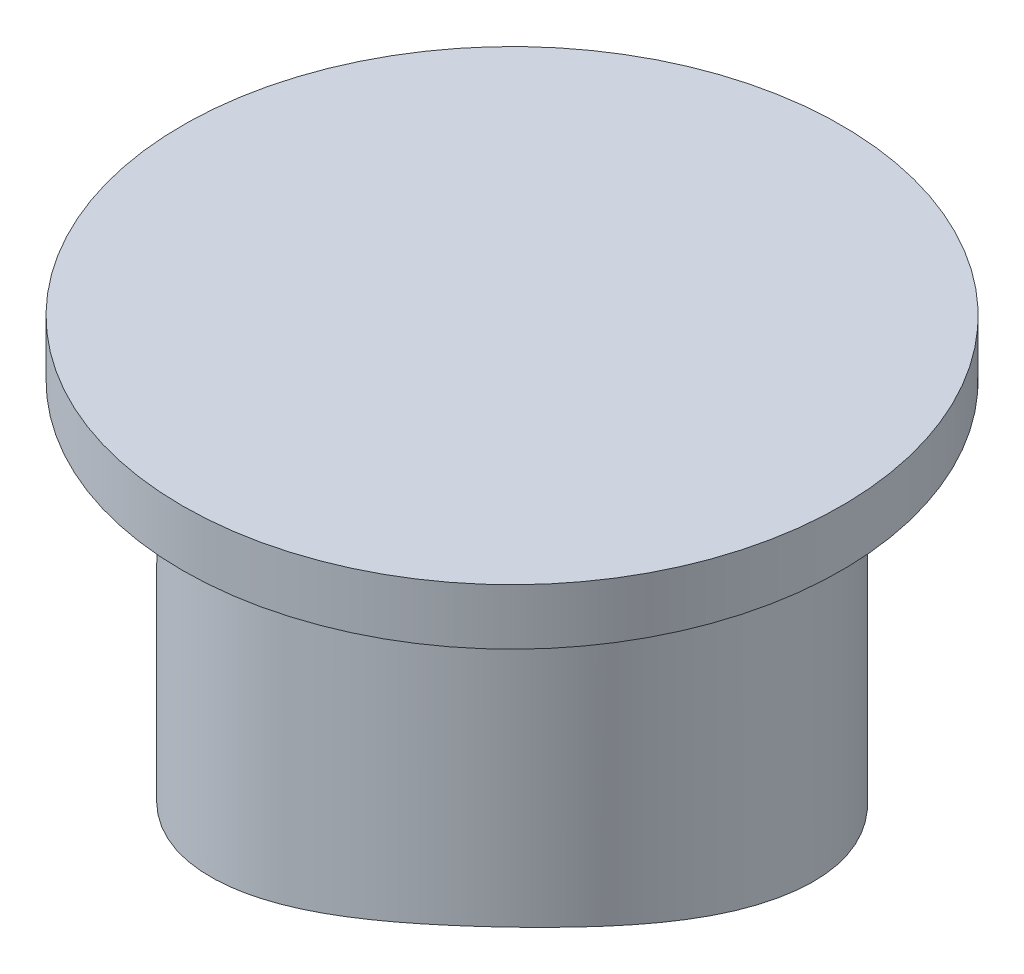
ISO-10303-21;
HEADER;
FILE_DESCRIPTION(('STEP AP214'),'2;1');
FILE_NAME('part.step','',(''),(''),'','','');
FILE_SCHEMA(('AUTOMOTIVE_DESIGN { 1 0 10303 214 1 1 1 1 }'));
ENDSEC;
DATA;
#1=APPLICATION_CONTEXT('core data for automotive mechanical design processes');
#2=APPLICATION_PROTOCOL_DEFINITION('international standard','automotive_design',2000,#1);
#3=PRODUCT_CONTEXT('',#1,'mechanical');
#4=PRODUCT('Part','Part','',(#3));
#5=PRODUCT_RELATED_PRODUCT_CATEGORY('part','',(#4));
#6=PRODUCT_DEFINITION_FORMATION('','',#4);
#7=PRODUCT_DEFINITION_CONTEXT('part definition',#1,'design');
#8=PRODUCT_DEFINITION('design','',#6,#7);
#9=PRODUCT_DEFINITION_SHAPE('','',#8);
#10=(LENGTH_UNIT() NAMED_UNIT(*) SI_UNIT(.MILLI.,.METRE.));
#11=(NAMED_UNIT(*) PLANE_ANGLE_UNIT() SI_UNIT($,.RADIAN.));
#12=(NAMED_UNIT(*) SI_UNIT($,.STERADIAN.) SOLID_ANGLE_UNIT());
#13=UNCERTAINTY_MEASURE_WITH_UNIT(LENGTH_MEASURE(1.E-05),#10,'distance_accuracy_value','');
#14=(GEOMETRIC_REPRESENTATION_CONTEXT(3) GLOBAL_UNCERTAINTY_ASSIGNED_CONTEXT((#13)) GLOBAL_UNIT_ASSIGNED_CONTEXT((#10,
#11,#12)) REPRESENTATION_CONTEXT('',''));
#15=CARTESIAN_POINT('',(0.,0.,0.));
#16=DIRECTION('',(0.,0.,1.));
#17=DIRECTION('',(1.,0.,0.));
#18=AXIS2_PLACEMENT_3D('',#15,#16,#17);
#19=CARTESIAN_POINT('',(0.,5.,0.));
#20=DIRECTION('',(0.,-1.,0.));
#21=DIRECTION('',(0.,0.,-1.));
#22=AXIS2_PLACEMENT_3D('',#19,#20,#21);
#23=CYLINDRICAL_SURFACE('',#22,29.5);
#24=CARTESIAN_POINT('',(0.,5.,0.));
#25=DIRECTION('',(0.,1.,0.));
#26=DIRECTION('',(0.,0.,1.));
#27=AXIS2_PLACEMENT_3D('',#24,#25,#26);
#28=CIRCLE('',#27,29.5);
#29=CARTESIAN_POINT('',(0.,5.,29.5));
#30=VERTEX_POINT('',#29);
#31=EDGE_CURVE('E43',#30,#30,#28,.T.);
#32=ORIENTED_EDGE('',*,*,#31,.F.);
#33=EDGE_LOOP('',(#32));
#34=FACE_BOUND('',#33,.T.);
#35=CARTESIAN_POINT('',(0.,0.,0.));
#36=DIRECTION('',(0.,1.,0.));
#37=DIRECTION('',(0.,0.,1.));
#38=AXIS2_PLACEMENT_3D('',#35,#36,#37);
#39=CIRCLE('',#38,29.5);
#40=CARTESIAN_POINT('',(0.,0.,29.5));
#41=VERTEX_POINT('',#40);
#42=EDGE_CURVE('E48',#41,#41,#39,.T.);
#43=ORIENTED_EDGE('',*,*,#42,.T.);
#44=EDGE_LOOP('',(#43));
#45=FACE_BOUND('',#44,.T.);
#46=ADVANCED_FACE('F31',(#34,#45),#23,.T.);
#47=CARTESIAN_POINT('',(0.,5.,0.));
#48=DIRECTION('',(0.,1.,0.));
#49=DIRECTION('',(0.,0.,1.));
#50=AXIS2_PLACEMENT_3D('',#47,#48,#49);
#51=PLANE('',#50);
#52=ORIENTED_EDGE('',*,*,#31,.T.);
#53=EDGE_LOOP('',(#52));
#54=FACE_BOUND('',#53,.T.);
#55=ADVANCED_FACE('F70',(#54),#51,.T.);
#56=CARTESIAN_POINT('',(0.,0.,0.));
#57=DIRECTION('',(0.,1.,0.));
#58=DIRECTION('',(0.,0.,1.));
#59=AXIS2_PLACEMENT_3D('',#56,#57,#58);
#60=PLANE('',#59);
#61=CARTESIAN_POINT('',(0.,0.,0.));
#62=DIRECTION('',(0.,-1.,0.));
#63=DIRECTION('',(0.,0.,-1.));
#64=AXIS2_PLACEMENT_3D('',#61,#62,#63);
#65=CIRCLE('',#64,22.5);
#66=CARTESIAN_POINT('',(0.,0.,-22.5));
#67=VERTEX_POINT('',#66);
#68=EDGE_CURVE('E10',#67,#67,#65,.T.);
#69=ORIENTED_EDGE('',*,*,#68,.F.);
#70=EDGE_LOOP('',(#69));
#71=FACE_BOUND('',#70,.T.);
#72=ORIENTED_EDGE('',*,*,#42,.F.);
#73=EDGE_LOOP('',(#72));
#74=FACE_BOUND('',#73,.T.);
#75=ADVANCED_FACE('F67',(#71,#74),#60,.F.);
#76=CARTESIAN_POINT('',(0.,-100.,0.));
#77=DIRECTION('',(0.,1.,0.));
#78=DIRECTION('',(0.,0.,1.));
#79=AXIS2_PLACEMENT_3D('',#76,#77,#78);
#80=CYLINDRICAL_SURFACE('',#79,22.5);
#81=CARTESIAN_POINT('',(0.,-28.9259306105046,22.5));
#82=CARTESIAN_POINT('',(0.622911070500631,-28.7873861796254,22.5000005439679));
#83=CARTESIAN_POINT('',(1.2460783406229,-28.6499191662909,22.4741218353335));
#84=CARTESIAN_POINT('',(2.48904660480459,-28.3790111703463,22.3705973816585));
#85=CARTESIAN_POINT('',(3.10884725022272,-28.2455705984262,22.2929463744651));
#86=CARTESIAN_POINT('',(4.34169762103869,-27.9852777841279,22.085983100574));
#87=CARTESIAN_POINT('',(4.95474176768081,-27.8584307054008,21.9566310133491));
#88=CARTESIAN_POINT('',(6.16976606090763,-27.6147462095684,21.6466409461382));
#89=CARTESIAN_POINT('',(6.77174645831102,-27.4979085653257,21.4660041303238));
#90=CARTESIAN_POINT('',(7.96284440007731,-27.2776346918617,21.053307211703));
#91=CARTESIAN_POINT('',(8.55190883531344,-27.174247393443,20.821067243803));
#92=CARTESIAN_POINT('',(9.71076731370074,-26.9854043089453,20.3064741351287));
#93=CARTESIAN_POINT('',(10.2805612560459,-26.8999486166562,20.024120732254));
#94=CARTESIAN_POINT('',(11.3957678003991,-26.7509348330807,19.4111015849221));
#95=CARTESIAN_POINT('',(11.9412064248498,-26.6873528588091,19.0804890981017));
#96=CARTESIAN_POINT('',(13.0036078258192,-26.5852108872523,18.3728984926291));
#97=CARTESIAN_POINT('',(13.5205733072643,-26.5466485093599,17.9959247892943));
#98=CARTESIAN_POINT('',(14.4876268574476,-26.498343476756,17.2254119975805));
#99=CARTESIAN_POINT('',(14.9398744760271,-26.4868375660033,16.8346904820804));
#100=CARTESIAN_POINT('',(15.8118154618078,-26.4880034912961,16.0185219327023));
#101=CARTESIAN_POINT('',(16.2315101965326,-26.5006743111211,15.5930763591001));
#102=CARTESIAN_POINT('',(17.035182137791,-26.5495643036583,14.7108372686828));
#103=CARTESIAN_POINT('',(17.4191527204667,-26.5857878335314,14.2540379655366));
#104=CARTESIAN_POINT('',(18.1486307627272,-26.6800434058686,13.3128403142628));
#105=CARTESIAN_POINT('',(18.4941379522523,-26.7380756014436,12.8284417723911));
#106=CARTESIAN_POINT('',(19.1299637122201,-26.8703023326734,11.8581473563886));
#107=CARTESIAN_POINT('',(19.4220676100654,-26.9436507224622,11.3733025653324));
#108=CARTESIAN_POINT('',(19.9680097237224,-27.1051713536212,10.3849558125286));
#109=CARTESIAN_POINT('',(20.2218495283808,-27.1933429791617,9.88145462653592));
#110=CARTESIAN_POINT('',(20.6903748987772,-27.3816904240048,8.85860653789441));
#111=CARTESIAN_POINT('',(20.9050511781649,-27.4818690810758,8.33925591105734));
#112=CARTESIAN_POINT('',(21.294488659233,-27.6914429521533,7.28760677847456));
#113=CARTESIAN_POINT('',(21.4692473618801,-27.8008387426104,6.75530746438548));
#114=CARTESIAN_POINT('',(21.7923017332882,-28.0365154645811,5.63181977343962));
#115=CARTESIAN_POINT('',(21.9367720255667,-28.1634285649006,5.0396610557698));
#116=CARTESIAN_POINT('',(22.1770907191235,-28.4223962602075,3.8466831728591));
#117=CARTESIAN_POINT('',(22.27293695335,-28.5544510840663,3.24586362285376));
#118=CARTESIAN_POINT('',(22.4156639769846,-28.8215850004876,2.03892084310857));
#119=CARTESIAN_POINT('',(22.462536524924,-28.9566645981645,1.43279673799939));
#120=CARTESIAN_POINT('',(22.4959792434927,-29.160432652936,0.522664064588083));
#121=CARTESIAN_POINT('',(22.5009810614285,-29.2285539595921,0.219096982053894));
#122=CARTESIAN_POINT('',(22.4987021684825,-29.3651006395827,-0.387943679853053));
#123=CARTESIAN_POINT('',(22.491421342445,-29.433526015762,-0.691417258322483));
#124=CARTESIAN_POINT('',(22.4637766289571,-29.5747767946198,-1.31619726436484));
#125=CARTESIAN_POINT('',(22.4426443778381,-29.6476168301549,-1.63746636523185));
#126=CARTESIAN_POINT('',(22.3866243631264,-29.7935874410855,-2.27873896032435));
#127=CARTESIAN_POINT('',(22.3517364479434,-29.8667180196741,-2.59874244056319));
#128=CARTESIAN_POINT('',(22.2682637119282,-30.013008127209,-3.23697395016571));
#129=CARTESIAN_POINT('',(22.2196782328637,-30.0861676573777,-3.55520189345687));
#130=CARTESIAN_POINT('',(22.1088940823436,-30.2321892662213,-4.1893236888794));
#131=CARTESIAN_POINT('',(22.0466954473063,-30.3050513456914,-4.50521754725262));
#132=CARTESIAN_POINT('',(21.8397709219696,-30.5227804289569,-5.44875481648457));
#133=CARTESIAN_POINT('',(21.6747142412717,-30.666794098664,-6.07227050985328));
#134=CARTESIAN_POINT('',(21.2913607597389,-30.9502042571749,-7.30369296987059));
#135=CARTESIAN_POINT('',(21.0730646947337,-31.0896008097622,-7.91159995212126));
#136=CARTESIAN_POINT('',(20.5831334227695,-31.3624696881205,-9.11077263033924));
#137=CARTESIAN_POINT('',(20.3112295087424,-31.495907835752,-9.70193659000417));
#138=CARTESIAN_POINT('',(19.7163782056031,-31.7542520765211,-10.8599363954082));
#139=CARTESIAN_POINT('',(19.3934303111726,-31.8791580851758,-11.4267720002342));
#140=CARTESIAN_POINT('',(18.6984533001305,-32.1188777914349,-12.5317004690492));
#141=CARTESIAN_POINT('',(18.3264363161796,-32.2336939721615,-13.0698003920727));
#142=CARTESIAN_POINT('',(17.7335236821652,-32.3974201562726,-13.8520509839671));
#143=CARTESIAN_POINT('',(17.5300481508023,-32.450584397294,-14.1086772278818));
#144=CARTESIAN_POINT('',(17.1117840266926,-32.5539703301077,-14.6131518118284));
#145=CARTESIAN_POINT('',(16.8969955042184,-32.6041920401738,-14.8610002063695));
#146=CARTESIAN_POINT('',(16.2488532317989,-32.747589327077,-15.5766101308124));
#147=CARTESIAN_POINT('',(15.8002477705977,-32.8366510907244,-16.0315434945806));
#148=CARTESIAN_POINT('',(14.864896790163,-33.0035937003742,-16.9024649019745));
#149=CARTESIAN_POINT('',(14.3781517467557,-33.0814746858326,-17.3184534313305));
#150=CARTESIAN_POINT('',(13.3699692000819,-33.2264320515881,-18.1081154672448));
#151=CARTESIAN_POINT('',(12.8485331721332,-33.2935088909432,-18.4817907714511));
#152=CARTESIAN_POINT('',(11.7748045518448,-33.4174558192793,-19.1837271372504));
#153=CARTESIAN_POINT('',(11.2225123610033,-33.4743260410275,-19.5119887895694));
#154=CARTESIAN_POINT('',(10.1045523288924,-33.5774123228297,-20.1132120405399));
#155=CARTESIAN_POINT('',(9.53950801861917,-33.6238481993877,-20.3872961551937));
#156=CARTESIAN_POINT('',(8.38797831299132,-33.7085847376346,-20.8874568280797));
#157=CARTESIAN_POINT('',(7.80149329371186,-33.7468855419344,-21.1135342278879));
#158=CARTESIAN_POINT('',(6.61129984412496,-33.8162667316164,-21.5159320362571));
#159=CARTESIAN_POINT('',(6.00759185685384,-33.847347302541,-21.6922537234444));
#160=CARTESIAN_POINT('',(4.78726017747451,-33.9032285830144,-21.9937986223213));
#161=CARTESIAN_POINT('',(4.17063642224281,-33.9280292618635,-22.1190215842139));
#162=CARTESIAN_POINT('',(2.92932268152446,-33.9722595184118,-22.317343939057));
#163=CARTESIAN_POINT('',(2.30463870516466,-33.9916928799387,-22.3904801096386));
#164=CARTESIAN_POINT('',(1.05122181699627,-34.0260889970917,-22.4842143200263));
#165=CARTESIAN_POINT('',(0.422488913792932,-34.041051762216,-22.5048124714553));
#166=CARTESIAN_POINT('',(-0.834579589938847,-34.0673154421187,-22.4933006142593));
#167=CARTESIAN_POINT('',(-1.46291518408094,-34.0786162994575,-22.4611897789045));
#168=CARTESIAN_POINT('',(-2.71473833650338,-34.0982795834026,-22.3444707012399));
#169=CARTESIAN_POINT('',(-3.33822587820528,-34.1066419999649,-22.2598622794888));
#170=CARTESIAN_POINT('',(-4.57846023915609,-34.1210872447608,-22.038287652205));
#171=CARTESIAN_POINT('',(-5.1951695694306,-34.1271607110048,-21.9011109507081));
#172=CARTESIAN_POINT('',(-6.41488793884769,-34.1375184927406,-21.5753949421817));
#173=CARTESIAN_POINT('',(-7.01789694375335,-34.1418028037618,-21.3868555068126));
#174=CARTESIAN_POINT('',(-8.20594382050675,-34.1490223441764,-20.9597461559476));
#175=CARTESIAN_POINT('',(-8.79098150811453,-34.1519575597433,-20.7211757277354));
#176=CARTESIAN_POINT('',(-9.93893307310563,-34.1568246957111,-20.1956948732795));
#177=CARTESIAN_POINT('',(-10.5018469390185,-34.1587566155918,-19.9087844219734));
#178=CARTESIAN_POINT('',(-11.6025178831267,-34.1618772437217,-19.2881166928223));
#179=CARTESIAN_POINT('',(-12.1402296414996,-34.1630646572834,-18.9542790361031));
#180=CARTESIAN_POINT('',(-13.1856303361522,-34.1648666948893,-18.2425059915357));
#181=CARTESIAN_POINT('',(-13.6933192312403,-34.1654813181476,-17.8645705431874));
#182=CARTESIAN_POINT('',(-14.6750674401732,-34.1662354881583,-17.0672865168255));
#183=CARTESIAN_POINT('',(-15.1491266789117,-34.1663750338498,-16.6479378463275));
#184=CARTESIAN_POINT('',(-16.0602458333805,-34.1662020016569,-15.7708077708147));
#185=CARTESIAN_POINT('',(-16.4973057547147,-34.165889423841,-15.3130263716209));
#186=CARTESIAN_POINT('',(-17.3314402273523,-34.1647609789533,-14.3621475168879));
#187=CARTESIAN_POINT('',(-17.7285033244491,-34.1639449681834,-13.869040013525));
#188=CARTESIAN_POINT('',(-18.479679231871,-34.1616826884703,-12.8511305691677));
#189=CARTESIAN_POINT('',(-18.8337920275364,-34.160236419312,-12.3263286173554));
#190=CARTESIAN_POINT('',(-19.4965501398631,-34.156506945778,-11.2487614000778));
#191=CARTESIAN_POINT('',(-19.8051953773864,-34.1542237399456,-10.6959960859435));
#192=CARTESIAN_POINT('',(-20.3748230695378,-34.1485283053392,-9.56643510098059));
#193=CARTESIAN_POINT('',(-20.6358055295082,-34.1451160766918,-8.98963943284551));
#194=CARTESIAN_POINT('',(-21.1082377366558,-34.1367792465451,-7.8161587271393));
#195=CARTESIAN_POINT('',(-21.3196905019806,-34.1318547372406,-7.21947490400758));
#196=CARTESIAN_POINT('',(-21.6915812698359,-34.1200129332856,-6.01043441431122));
#197=CARTESIAN_POINT('',(-21.8520192620417,-34.1130956382317,-5.39807774457458));
#198=CARTESIAN_POINT('',(-22.1207428265659,-34.0966880323903,-4.1620579395416));
#199=CARTESIAN_POINT('',(-22.2290282807403,-34.0871977157741,-3.53839477863534));
#200=CARTESIAN_POINT('',(-22.3926833668569,-34.064964655223,-2.28422058206752));
#201=CARTESIAN_POINT('',(-22.4480530403454,-34.0522219138417,-1.6537095517829));
#202=CARTESIAN_POINT('',(-22.5054750685401,-34.0227232082562,-0.390871292737471));
#203=CARTESIAN_POINT('',(-22.507570757785,-34.0059705170555,0.241454041416062));
#204=CARTESIAN_POINT('',(-22.4585694117005,-33.9675945667955,1.50389356241109));
#205=CARTESIAN_POINT('',(-22.4074723932979,-33.9459713092863,2.13400774995616));
#206=CARTESIAN_POINT('',(-22.2525004947162,-33.8969411718628,3.38747951725176));
#207=CARTESIAN_POINT('',(-22.1486261841974,-33.8695343543762,4.01083716985589));
#208=CARTESIAN_POINT('',(-21.8889201843155,-33.8079894634055,5.2462957470414));
#209=CARTESIAN_POINT('',(-21.733088649884,-33.7738514099934,5.85839670518347));
#210=CARTESIAN_POINT('',(-21.37126513439,-33.6980158849799,7.06501958900176));
#211=CARTESIAN_POINT('',(-21.1654311638899,-33.6563423300192,7.65959040095146));
#212=CARTESIAN_POINT('',(-20.7049796367042,-33.5644694659436,8.82885098656372));
#213=CARTESIAN_POINT('',(-20.4503622291298,-33.5142701828885,9.40354082098806));
#214=CARTESIAN_POINT('',(-19.8943988323016,-33.4045444278828,10.5288512808191));
#215=CARTESIAN_POINT('',(-19.5930576756144,-33.3450189205227,11.0794743878695));
#216=CARTESIAN_POINT('',(-18.9460387005175,-33.2159691898479,12.1527887500871));
#217=CARTESIAN_POINT('',(-18.6003609690703,-33.1464449861447,12.6754800600372));
#218=CARTESIAN_POINT('',(-17.8687021608491,-32.9971726669405,13.6875136814736));
#219=CARTESIAN_POINT('',(-17.4828639815251,-32.9174605853719,14.1769646420391));
#220=CARTESIAN_POINT('',(-16.6729631649993,-32.7473904920912,15.121149152825));
#221=CARTESIAN_POINT('',(-16.248900763153,-32.6570325459273,15.5758829167756));
#222=CARTESIAN_POINT('',(-15.3658031394554,-32.4656462736576,16.447709904242));
#223=CARTESIAN_POINT('',(-14.9067625194329,-32.3646162996098,16.8647972960252));
#224=CARTESIAN_POINT('',(-13.9572147547466,-32.15268003905,17.6586847982886));
#225=CARTESIAN_POINT('',(-13.4667073319475,-32.0417736652369,18.0354845525874));
#226=CARTESIAN_POINT('',(-12.4525098382944,-31.8100011414334,18.7503037722505));
#227=CARTESIAN_POINT('',(-11.9285274904154,-31.6890433285474,19.0878786996708));
#228=CARTESIAN_POINT('',(-10.8557326036285,-31.4395758410158,19.7177586738906));
#229=CARTESIAN_POINT('',(-10.3069192873208,-31.311065929894,20.0100623020821));
#230=CARTESIAN_POINT('',(-9.18835164663394,-31.0481678679228,20.5477287033717));
#231=CARTESIAN_POINT('',(-8.61860396262032,-30.9137815785288,20.7931062107541));
#232=CARTESIAN_POINT('',(-7.46172015692422,-30.6409258664956,21.2357312251508));
#233=CARTESIAN_POINT('',(-6.87458556063251,-30.5024568020517,21.4329829403975));
#234=CARTESIAN_POINT('',(-5.77112884719538,-30.2432946795149,21.7537472919618));
#235=CARTESIAN_POINT('',(-5.25662746140876,-30.1228778581457,21.8837603049101));
#236=CARTESIAN_POINT('',(-4.47909624317744,-29.9421186467342,22.0512588838518));
#237=CARTESIAN_POINT('',(-4.21895145366024,-29.8818422078549,22.1025055652103));
#238=CARTESIAN_POINT('',(-3.69697038257282,-29.7614267445838,22.1957808743669));
#239=CARTESIAN_POINT('',(-3.43513408946083,-29.7012877211334,22.2378094391977));
#240=CARTESIAN_POINT('',(-2.91010629871158,-29.5812017243816,22.3125881394598));
#241=CARTESIAN_POINT('',(-2.6469148507873,-29.5212547441643,22.3453386128174));
#242=CARTESIAN_POINT('',(-2.11950833447561,-29.4015508147854,22.4015183719913));
#243=CARTESIAN_POINT('',(-1.85529327343792,-29.3417938642649,22.4249477246101));
#244=CARTESIAN_POINT('',(-1.06153481157038,-29.1628552056484,22.4812032924695));
#245=CARTESIAN_POINT('',(-0.530860443089853,-29.044001650573,22.4999995364169));
#246=CARTESIAN_POINT('',(0.,-28.9259306105046,22.5));
#247=B_SPLINE_CURVE_WITH_KNOTS('',3,(#81,#82,#83,#84,#85,#86,#87,#88,#89,#90,#91,#92,#93,#94,
#95,#96,#97,#98,#99,#100,#101,#102,#103,#104,#105,#106,#107,#108,#109,#110,#111,#112,#113,#114,
#115,#116,#117,#118,#119,#120,#121,#122,#123,#124,#125,#126,#127,#128,#129,#130,#131,#132,#133,
#134,#135,#136,#137,#138,#139,#140,#141,#142,#143,#144,#145,#146,#147,#148,#149,#150,#151,#152,
#153,#154,#155,#156,#157,#158,#159,#160,#161,#162,#163,#164,#165,#166,#167,#168,#169,#170,#171,
#172,#173,#174,#175,#176,#177,#178,#179,#180,#181,#182,#183,#184,#185,#186,#187,#188,#189,#190,
#191,#192,#193,#194,#195,#196,#197,#198,#199,#200,#201,#202,#203,#204,#205,#206,#207,#208,#209,
#210,#211,#212,#213,#214,#215,#216,#217,#218,#219,#220,#221,#222,#223,#224,#225,#226,#227,#228,
#229,#230,#231,#232,#233,#234,#235,#236,#237,#238,#239,#240,#241,#242,#243,#244,#245,#246),
.UNSPECIFIED.,.T.,.F.,(4,2,2,2,2,2,2,2,2,2,2,2,2,2,2,2,2,2,2,2,2,2,2,2,2,2,2,2,2,2,2,2,2,2,2,2,
2,2,2,2,2,2,2,2,2,2,2,2,2,2,2,2,2,2,2,2,2,2,2,2,2,2,2,2,2,2,2,2,2,2,2,2,2,2,2,2,2,2,2,2,2,2,4),
(0.,1.91389586320255,3.82798628504373,5.74355380214456,7.65907783902475,9.58138628148141,
11.503704778185,13.4239176653659,15.3439478180572,17.1348940918737,18.9257650885101,
20.7169674836951,22.5081824545003,24.2186817583715,25.9291100173095,27.6399433227581,
29.350883705304,31.2166392890811,33.0824780175811,34.9486306856059,35.8819020929354,
36.8151822501884,37.8051926906853,38.7952140416038,39.785282975812,40.7753492614031,
42.7554305122885,44.735484397715,46.7257278191126,48.7159909444861,50.705762883263,
51.7008602152819,52.695951366802,54.6286382596211,56.561301044243,58.493881690189,
60.4264371953891,62.3133716047446,64.2002729326843,66.0871257664623,67.9739878240466,
69.8595162747825,71.7450407194946,73.630594738553,75.516155202632,77.4093461558008,
79.302541839509,81.1957569255785,83.0889729932019,84.9854722751551,86.8819741590499,
88.7784802783278,90.6749861103584,92.5720335248311,94.4690815867927,96.3661329505979,
98.2631841017719,100.160119623912,102.057055529972,103.953995733249,105.850934447162,
107.746330089006,109.641725127699,111.537099708569,113.432468637655,115.321924273582,
117.211374134298,119.100628702269,120.98987956469,122.872624174761,124.755357193122,
126.638381363544,128.521422180331,130.42406553533,132.326768498944,134.228873050388,
136.130811217679,137.761939948192,138.577532386769,139.393130396328,140.208698696386,
141.024261151331,142.655331225509),.UNSPECIFIED.);
#248=CARTESIAN_POINT('',(0.,-28.9259306105046,22.5));
#249=VERTEX_POINT('',#248);
#250=EDGE_CURVE('E34',#249,#249,#247,.T.);
#251=ORIENTED_EDGE('',*,*,#250,.T.);
#252=EDGE_LOOP('',(#251));
#253=FACE_BOUND('',#252,.T.);
#254=ORIENTED_EDGE('',*,*,#68,.T.);
#255=EDGE_LOOP('',(#254));
#256=FACE_BOUND('',#255,.T.);
#257=ADVANCED_FACE('F60',(#253,#256),#80,.T.);
#258=CARTESIAN_POINT('',(87.7071376600521,-22.496404241957,-43.0407865351335));
#259=CARTESIAN_POINT('',(84.9268620096004,-26.2835297214002,-46.0225444332209));
#260=CARTESIAN_POINT('',(78.5640175346356,-29.7720952956395,-52.8464943406504));
#261=CARTESIAN_POINT('',(65.3287592635466,-34.0282228631563,-67.0408911719988));
#262=CARTESIAN_POINT('',(55.4084538713319,-34.2271735325335,-77.6801056505596));
#263=CARTESIAN_POINT('',(48.5220257437179,-34.1694868264665,-85.0655825027517));
#264=B_SPLINE_CURVE_WITH_KNOTS('',3,(#258,#259,#260,#261,#262,#263),.UNSPECIFIED.,.F.,.F.,(4,1,
1,4),(0.,0.275397131738745,0.491276311230339,1.),.UNSPECIFIED.);
#265=DIRECTION('',(-0.731385335798708,0.,0.681964434980749));
#266=VECTOR('',#265,1.);
#267=SURFACE_OF_LINEAR_EXTRUSION('',#264,#266);
#268=ORIENTED_EDGE('',*,*,#250,.F.);
#269=EDGE_LOOP('',(#268));
#270=FACE_BOUND('',#269,.T.);
#271=ADVANCED_FACE('F62',(#270),#267,.F.);
#272=CLOSED_SHELL('',(#46,#55,#75,#257,#271));
#273=MANIFOLD_SOLID_BREP('B2',#272);
#274=ADVANCED_BREP_SHAPE_REPRESENTATION('',(#18,#273),#14);
#275=SHAPE_DEFINITION_REPRESENTATION(#9,#274);
ENDSEC;
END-ISO-10303-21;
